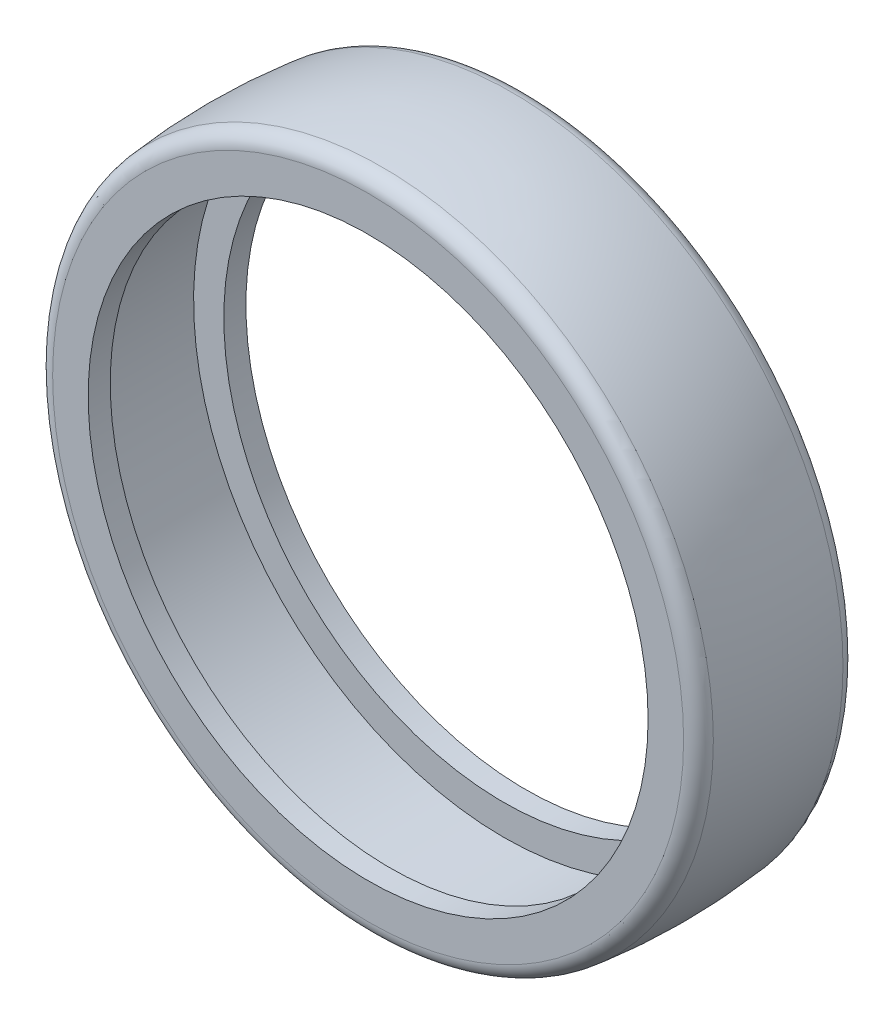
ISO-10303-21;
HEADER;
FILE_DESCRIPTION(('STEP AP214'),'2;1');
FILE_NAME('part.step','',(''),(''),'','','');
FILE_SCHEMA(('AUTOMOTIVE_DESIGN { 1 0 10303 214 1 1 1 1 }'));
ENDSEC;
DATA;
#1=APPLICATION_CONTEXT('core data for automotive mechanical design processes');
#2=APPLICATION_PROTOCOL_DEFINITION('international standard','automotive_design',2000,#1);
#3=PRODUCT_CONTEXT('',#1,'mechanical');
#4=PRODUCT('Part','Part','',(#3));
#5=PRODUCT_RELATED_PRODUCT_CATEGORY('part','',(#4));
#6=PRODUCT_DEFINITION_FORMATION('','',#4);
#7=PRODUCT_DEFINITION_CONTEXT('part definition',#1,'design');
#8=PRODUCT_DEFINITION('design','',#6,#7);
#9=PRODUCT_DEFINITION_SHAPE('','',#8);
#10=(LENGTH_UNIT() NAMED_UNIT(*) SI_UNIT(.MILLI.,.METRE.));
#11=(NAMED_UNIT(*) PLANE_ANGLE_UNIT() SI_UNIT($,.RADIAN.));
#12=(NAMED_UNIT(*) SI_UNIT($,.STERADIAN.) SOLID_ANGLE_UNIT());
#13=UNCERTAINTY_MEASURE_WITH_UNIT(LENGTH_MEASURE(1.E-05),#10,'distance_accuracy_value','');
#14=(GEOMETRIC_REPRESENTATION_CONTEXT(3) GLOBAL_UNCERTAINTY_ASSIGNED_CONTEXT((#13)) GLOBAL_UNIT_ASSIGNED_CONTEXT((#10,
#11,#12)) REPRESENTATION_CONTEXT('',''));
#15=CARTESIAN_POINT('',(0.,0.,0.));
#16=DIRECTION('',(0.,0.,1.));
#17=DIRECTION('',(1.,0.,0.));
#18=AXIS2_PLACEMENT_3D('',#15,#16,#17);
#19=CARTESIAN_POINT('',(0.,31.83,6.));
#20=DIRECTION('',(0.,0.,-1.));
#21=DIRECTION('',(-1.,0.,0.));
#22=AXIS2_PLACEMENT_3D('',#19,#20,#21);
#23=PLANE('',#22);
#24=CARTESIAN_POINT('',(0.,0.,6.));
#25=DIRECTION('',(0.,0.,-1.));
#26=DIRECTION('',(-1.,0.,0.));
#27=AXIS2_PLACEMENT_3D('',#24,#25,#26);
#28=CIRCLE('',#27,30.0017477313466);
#29=CARTESIAN_POINT('',(-30.0017477313466,0.,6.));
#30=VERTEX_POINT('',#29);
#31=EDGE_CURVE('E11',#30,#30,#28,.F.);
#32=ORIENTED_EDGE('',*,*,#31,.T.);
#33=EDGE_LOOP('',(#32));
#34=FACE_BOUND('',#33,.T.);
#35=CARTESIAN_POINT('',(0.,0.,6.));
#36=DIRECTION('',(0.,0.,1.));
#37=DIRECTION('',(1.,0.,0.));
#38=AXIS2_PLACEMENT_3D('',#35,#36,#37);
#39=CIRCLE('',#38,26.625);
#40=CARTESIAN_POINT('',(26.625,0.,6.));
#41=VERTEX_POINT('',#40);
#42=EDGE_CURVE('E105',#41,#41,#39,.T.);
#43=ORIENTED_EDGE('',*,*,#42,.F.);
#44=EDGE_LOOP('',(#43));
#45=FACE_BOUND('',#44,.T.);
#46=ADVANCED_FACE('F33',(#34,#45),#23,.F.);
#47=CARTESIAN_POINT('',(0.,26.625,-9.));
#48=DIRECTION('',(0.,0.,1.));
#49=DIRECTION('',(1.,0.,0.));
#50=AXIS2_PLACEMENT_3D('',#47,#48,#49);
#51=PLANE('',#50);
#52=CARTESIAN_POINT('',(0.,0.,-9.));
#53=DIRECTION('',(0.,0.,1.));
#54=DIRECTION('',(1.,0.,0.));
#55=AXIS2_PLACEMENT_3D('',#52,#53,#54);
#56=CIRCLE('',#55,30.0017477313466);
#57=CARTESIAN_POINT('',(30.0017477313466,0.,-9.));
#58=VERTEX_POINT('',#57);
#59=EDGE_CURVE('E41',#58,#58,#56,.F.);
#60=ORIENTED_EDGE('',*,*,#59,.T.);
#61=EDGE_LOOP('',(#60));
#62=FACE_BOUND('',#61,.T.);
#63=CARTESIAN_POINT('',(0.,0.,-9.));
#64=DIRECTION('',(0.,0.,1.));
#65=DIRECTION('',(1.,0.,0.));
#66=AXIS2_PLACEMENT_3D('',#63,#64,#65);
#67=CIRCLE('',#66,26.625);
#68=CARTESIAN_POINT('',(26.625,0.,-9.));
#69=VERTEX_POINT('',#68);
#70=EDGE_CURVE('E99',#69,#69,#67,.T.);
#71=ORIENTED_EDGE('',*,*,#70,.T.);
#72=EDGE_LOOP('',(#71));
#73=FACE_BOUND('',#72,.T.);
#74=ADVANCED_FACE('F116',(#62,#73),#51,.F.);
#75=CARTESIAN_POINT('',(0.,26.625,3.9));
#76=DIRECTION('',(0.,0.,1.));
#77=DIRECTION('',(1.,0.,0.));
#78=AXIS2_PLACEMENT_3D('',#75,#76,#77);
#79=PLANE('',#78);
#80=CARTESIAN_POINT('',(0.,0.,3.9));
#81=DIRECTION('',(0.,0.,1.));
#82=DIRECTION('',(1.,0.,0.));
#83=AXIS2_PLACEMENT_3D('',#80,#81,#82);
#84=CIRCLE('',#83,26.625);
#85=CARTESIAN_POINT('',(-4.62338273038203,26.22050642395,3.9));
#86=VERTEX_POINT('',#85);
#87=CARTESIAN_POINT('',(4.62338273038203,26.22050642395,3.9));
#88=VERTEX_POINT('',#87);
#89=EDGE_CURVE('E97',#86,#88,#84,.T.);
#90=ORIENTED_EDGE('',*,*,#89,.T.);
#91=DIRECTION('',(-0.173648177666931,-0.984807753012208,0.));
#92=VECTOR('',#91,1.);
#93=CARTESIAN_POINT('',(5.12262124117446,29.0518287138601,3.9));
#94=LINE('',#93,#92);
#95=CARTESIAN_POINT('',(5.12262124117446,29.0518287138601,3.9));
#96=VERTEX_POINT('',#95);
#97=EDGE_CURVE('E160',#96,#88,#94,.T.);
#98=ORIENTED_EDGE('',*,*,#97,.F.);
#99=CARTESIAN_POINT('',(0.,0.,3.9));
#100=DIRECTION('',(0.,0.,1.));
#101=DIRECTION('',(1.,0.,0.));
#102=AXIS2_PLACEMENT_3D('',#99,#100,#101);
#103=CIRCLE('',#102,29.5);
#104=CARTESIAN_POINT('',(-5.12262124117446,29.0518287138601,3.9));
#105=VERTEX_POINT('',#104);
#106=EDGE_CURVE('E95',#105,#96,#103,.T.);
#107=ORIENTED_EDGE('',*,*,#106,.F.);
#108=DIRECTION('',(0.173648177666931,-0.984807753012208,0.));
#109=VECTOR('',#108,1.);
#110=CARTESIAN_POINT('',(-5.12262124117446,29.0518287138601,3.9));
#111=LINE('',#110,#109);
#112=EDGE_CURVE('E80',#105,#86,#111,.T.);
#113=ORIENTED_EDGE('',*,*,#112,.T.);
#114=EDGE_LOOP('',(#90,#98,#107,#113));
#115=FACE_BOUND('',#114,.T.);
#116=ADVANCED_FACE('F153',(#115),#79,.F.);
#117=CARTESIAN_POINT('',(0.,0.,0.));
#118=DIRECTION('',(0.,0.,1.));
#119=DIRECTION('',(1.,0.,0.));
#120=AXIS2_PLACEMENT_3D('',#117,#118,#119);
#121=CYLINDRICAL_SURFACE('',#120,29.5);
#122=ORIENTED_EDGE('',*,*,#106,.T.);
#123=DIRECTION('',(0.,0.,1.));
#124=VECTOR('',#123,1.);
#125=CARTESIAN_POINT('',(5.12262124117446,29.0518287138601,3.9));
#126=LINE('',#125,#124);
#127=CARTESIAN_POINT('',(5.12262124117446,29.0518287138601,-6.9));
#128=VERTEX_POINT('',#127);
#129=EDGE_CURVE('E94',#128,#96,#126,.T.);
#130=ORIENTED_EDGE('',*,*,#129,.F.);
#131=CARTESIAN_POINT('',(0.,0.,-6.9));
#132=DIRECTION('',(0.,0.,1.));
#133=DIRECTION('',(1.,0.,0.));
#134=AXIS2_PLACEMENT_3D('',#131,#132,#133);
#135=CIRCLE('',#134,29.5);
#136=CARTESIAN_POINT('',(-5.12262124117446,29.0518287138601,-6.9));
#137=VERTEX_POINT('',#136);
#138=EDGE_CURVE('E89',#137,#128,#135,.T.);
#139=ORIENTED_EDGE('',*,*,#138,.F.);
#140=DIRECTION('',(0.,0.,1.));
#141=VECTOR('',#140,1.);
#142=CARTESIAN_POINT('',(-5.12262124117446,29.0518287138601,3.9));
#143=LINE('',#142,#141);
#144=EDGE_CURVE('E74',#137,#105,#143,.T.);
#145=ORIENTED_EDGE('',*,*,#144,.T.);
#146=EDGE_LOOP('',(#122,#130,#139,#145));
#147=FACE_BOUND('',#146,.T.);
#148=ADVANCED_FACE('F93',(#147),#121,.F.);
#149=CARTESIAN_POINT('',(0.,29.5,-6.9));
#150=DIRECTION('',(0.,0.,-1.));
#151=DIRECTION('',(-1.,0.,0.));
#152=AXIS2_PLACEMENT_3D('',#149,#150,#151);
#153=PLANE('',#152);
#154=ORIENTED_EDGE('',*,*,#138,.T.);
#155=DIRECTION('',(0.173648177666931,0.984807753012208,0.));
#156=VECTOR('',#155,1.);
#157=CARTESIAN_POINT('',(5.12262124117446,29.0518287138601,-6.9));
#158=LINE('',#157,#156);
#159=CARTESIAN_POINT('',(4.62338273038203,26.22050642395,-6.9));
#160=VERTEX_POINT('',#159);
#161=EDGE_CURVE('E166',#160,#128,#158,.T.);
#162=ORIENTED_EDGE('',*,*,#161,.F.);
#163=CARTESIAN_POINT('',(0.,0.,-6.9));
#164=DIRECTION('',(0.,0.,1.));
#165=DIRECTION('',(1.,0.,0.));
#166=AXIS2_PLACEMENT_3D('',#163,#164,#165);
#167=CIRCLE('',#166,26.625);
#168=CARTESIAN_POINT('',(-4.62338273038203,26.22050642395,-6.9));
#169=VERTEX_POINT('',#168);
#170=EDGE_CURVE('E90',#169,#160,#167,.T.);
#171=ORIENTED_EDGE('',*,*,#170,.F.);
#172=DIRECTION('',(-0.173648177666931,0.984807753012208,0.));
#173=VECTOR('',#172,1.);
#174=CARTESIAN_POINT('',(-5.12262124117446,29.0518287138601,-6.9));
#175=LINE('',#174,#173);
#176=EDGE_CURVE('E77',#169,#137,#175,.T.);
#177=ORIENTED_EDGE('',*,*,#176,.T.);
#178=EDGE_LOOP('',(#154,#162,#171,#177));
#179=FACE_BOUND('',#178,.T.);
#180=ADVANCED_FACE('F88',(#179),#153,.F.);
#181=CARTESIAN_POINT('',(0.,0.,0.));
#182=DIRECTION('',(0.,0.,1.));
#183=DIRECTION('',(1.,0.,0.));
#184=AXIS2_PLACEMENT_3D('',#181,#182,#183);
#185=CYLINDRICAL_SURFACE('',#184,26.625);
#186=ORIENTED_EDGE('',*,*,#70,.F.);
#187=EDGE_LOOP('',(#186));
#188=FACE_BOUND('',#187,.T.);
#189=ORIENTED_EDGE('',*,*,#170,.T.);
#190=DIRECTION('',(0.,0.,-1.));
#191=VECTOR('',#190,1.);
#192=CARTESIAN_POINT('',(4.62338273038203,26.22050642395,3.9));
#193=LINE('',#192,#191);
#194=EDGE_CURVE('E56',#88,#160,#193,.T.);
#195=ORIENTED_EDGE('',*,*,#194,.F.);
#196=ORIENTED_EDGE('',*,*,#89,.F.);
#197=DIRECTION('',(0.,0.,-1.));
#198=VECTOR('',#197,1.);
#199=CARTESIAN_POINT('',(-4.62338273038203,26.22050642395,3.9));
#200=LINE('',#199,#198);
#201=EDGE_CURVE('E48',#86,#169,#200,.T.);
#202=ORIENTED_EDGE('',*,*,#201,.T.);
#203=EDGE_LOOP('',(#189,#195,#196,#202));
#204=FACE_BOUND('',#203,.T.);
#205=ORIENTED_EDGE('',*,*,#42,.T.);
#206=EDGE_LOOP('',(#205));
#207=FACE_BOUND('',#206,.T.);
#208=ADVANCED_FACE('F127',(#188,#204,#207),#185,.F.);
#209=CARTESIAN_POINT('',(0.,0.,-1.5));
#210=DIRECTION('',(0.,0.,1.));
#211=DIRECTION('',(1.,0.,0.));
#212=AXIS2_PLACEMENT_3D('',#209,#210,#211);
#213=DEGENERATE_TOROIDAL_SURFACE('',#212,24.67,56.5,.F.);
#214=CARTESIAN_POINT('',(0.,0.,-7.66363636363636));
#215=DIRECTION('',(0.,0.,1.));
#216=DIRECTION('',(1.,0.,0.));
#217=AXIS2_PLACEMENT_3D('',#214,#215,#216);
#218=CIRCLE('',#217,31.4927953967469);
#219=CARTESIAN_POINT('',(31.4927953967469,0.,-7.66363636363636));
#220=VERTEX_POINT('',#219);
#221=EDGE_CURVE('E111',#220,#220,#218,.T.);
#222=ORIENTED_EDGE('',*,*,#221,.T.);
#223=EDGE_LOOP('',(#222));
#224=FACE_BOUND('',#223,.T.);
#225=CARTESIAN_POINT('',(0.,0.,4.66363636363637));
#226=DIRECTION('',(0.,0.,-1.));
#227=DIRECTION('',(-1.,0.,0.));
#228=AXIS2_PLACEMENT_3D('',#225,#226,#227);
#229=CIRCLE('',#228,31.4927953967469);
#230=CARTESIAN_POINT('',(-31.4927953967469,0.,4.66363636363637));
#231=VERTEX_POINT('',#230);
#232=EDGE_CURVE('E108',#231,#231,#229,.T.);
#233=ORIENTED_EDGE('',*,*,#232,.T.);
#234=EDGE_LOOP('',(#233));
#235=FACE_BOUND('',#234,.T.);
#236=ADVANCED_FACE('F122',(#224,#235),#213,.F.);
#237=CARTESIAN_POINT('',(0.,0.,-7.5));
#238=DIRECTION('',(0.,0.,1.));
#239=DIRECTION('',(1.,0.,0.));
#240=AXIS2_PLACEMENT_3D('',#237,#238,#239);
#241=TOROIDAL_SURFACE('',#240,30.0017477313466,1.5);
#242=ORIENTED_EDGE('',*,*,#59,.F.);
#243=EDGE_LOOP('',(#242));
#244=FACE_BOUND('',#243,.T.);
#245=ORIENTED_EDGE('',*,*,#221,.F.);
#246=EDGE_LOOP('',(#245));
#247=FACE_BOUND('',#246,.T.);
#248=ADVANCED_FACE('F119',(#244,#247),#241,.T.);
#249=CARTESIAN_POINT('',(0.,0.,4.5));
#250=DIRECTION('',(0.,0.,-1.));
#251=DIRECTION('',(-1.,0.,0.));
#252=AXIS2_PLACEMENT_3D('',#249,#250,#251);
#253=TOROIDAL_SURFACE('',#252,30.0017477313466,1.5);
#254=ORIENTED_EDGE('',*,*,#232,.F.);
#255=EDGE_LOOP('',(#254));
#256=FACE_BOUND('',#255,.T.);
#257=ORIENTED_EDGE('',*,*,#31,.F.);
#258=EDGE_LOOP('',(#257));
#259=FACE_BOUND('',#258,.T.);
#260=ADVANCED_FACE('F35',(#256,#259),#253,.T.);
#261=CARTESIAN_POINT('',(0.,0.,0.));
#262=DIRECTION('',(0.984807753012208,-0.173648177666931,0.));
#263=DIRECTION('',(0.,0.,-1.));
#264=AXIS2_PLACEMENT_3D('',#261,#262,#263);
#265=PLANE('',#264);
#266=ORIENTED_EDGE('',*,*,#161,.T.);
#267=ORIENTED_EDGE('',*,*,#129,.T.);
#268=ORIENTED_EDGE('',*,*,#97,.T.);
#269=ORIENTED_EDGE('',*,*,#194,.T.);
#270=EDGE_LOOP('',(#266,#267,#268,#269));
#271=FACE_BOUND('',#270,.T.);
#272=ADVANCED_FACE('F133',(#271),#265,.T.);
#273=CARTESIAN_POINT('',(0.,0.,0.));
#274=DIRECTION('',(0.984807753012208,0.173648177666931,0.));
#275=DIRECTION('',(0.,0.,-1.));
#276=AXIS2_PLACEMENT_3D('',#273,#274,#275);
#277=PLANE('',#276);
#278=ORIENTED_EDGE('',*,*,#176,.F.);
#279=ORIENTED_EDGE('',*,*,#201,.F.);
#280=ORIENTED_EDGE('',*,*,#112,.F.);
#281=ORIENTED_EDGE('',*,*,#144,.F.);
#282=EDGE_LOOP('',(#278,#279,#280,#281));
#283=FACE_BOUND('',#282,.T.);
#284=ADVANCED_FACE('F76',(#283),#277,.F.);
#285=CLOSED_SHELL('',(#46,#74,#116,#148,#180,#208,#236,#248,#260,#272,#284));
#286=MANIFOLD_SOLID_BREP('B2',#285);
#287=ADVANCED_BREP_SHAPE_REPRESENTATION('',(#18,#286),#14);
#288=SHAPE_DEFINITION_REPRESENTATION(#9,#287);
ENDSEC;
END-ISO-10303-21;
